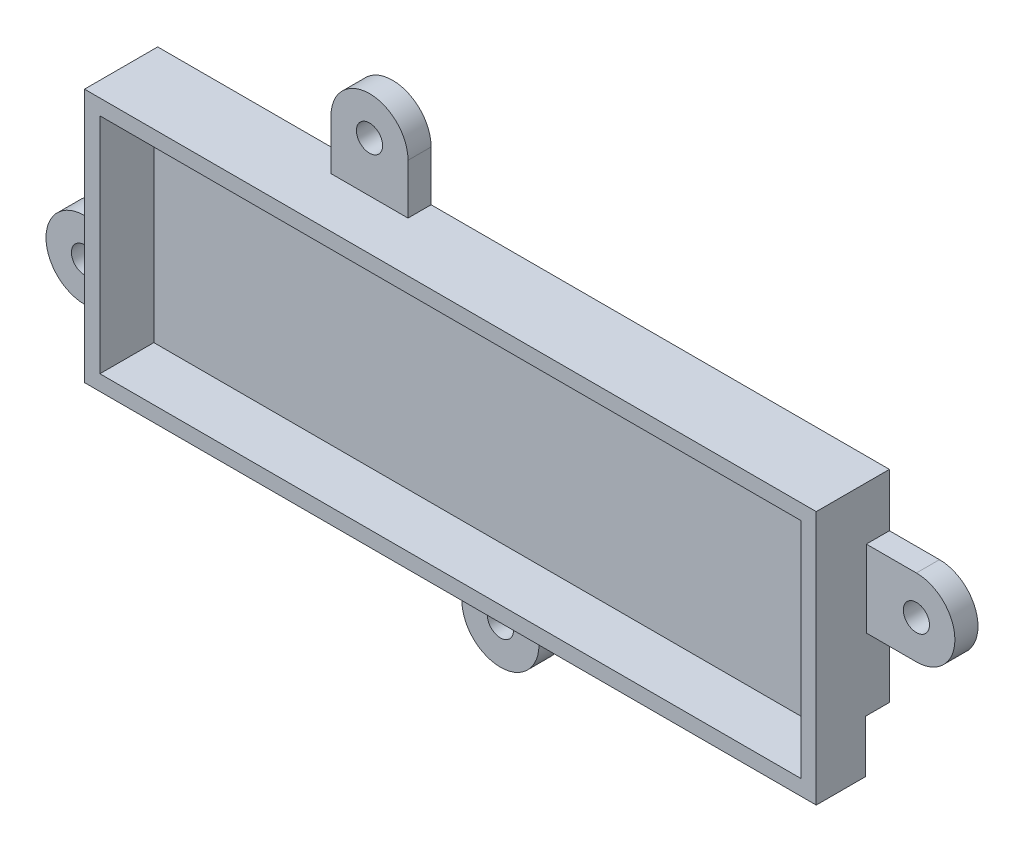
ISO-10303-21;
HEADER;
FILE_DESCRIPTION(('STEP AP214'),'2;1');
FILE_NAME('part.step','',(''),(''),'','','');
FILE_SCHEMA(('AUTOMOTIVE_DESIGN { 1 0 10303 214 1 1 1 1 }'));
ENDSEC;
DATA;
#1=APPLICATION_CONTEXT('core data for automotive mechanical design processes');
#2=APPLICATION_PROTOCOL_DEFINITION('international standard','automotive_design',2000,#1);
#3=PRODUCT_CONTEXT('',#1,'mechanical');
#4=PRODUCT('Part','Part','',(#3));
#5=PRODUCT_RELATED_PRODUCT_CATEGORY('part','',(#4));
#6=PRODUCT_DEFINITION_FORMATION('','',#4);
#7=PRODUCT_DEFINITION_CONTEXT('part definition',#1,'design');
#8=PRODUCT_DEFINITION('design','',#6,#7);
#9=PRODUCT_DEFINITION_SHAPE('','',#8);
#10=(LENGTH_UNIT() NAMED_UNIT(*) SI_UNIT(.MILLI.,.METRE.));
#11=(NAMED_UNIT(*) PLANE_ANGLE_UNIT() SI_UNIT($,.RADIAN.));
#12=(NAMED_UNIT(*) SI_UNIT($,.STERADIAN.) SOLID_ANGLE_UNIT());
#13=UNCERTAINTY_MEASURE_WITH_UNIT(LENGTH_MEASURE(1.E-05),#10,'distance_accuracy_value','');
#14=(GEOMETRIC_REPRESENTATION_CONTEXT(3) GLOBAL_UNCERTAINTY_ASSIGNED_CONTEXT((#13)) GLOBAL_UNIT_ASSIGNED_CONTEXT((#10,
#11,#12)) REPRESENTATION_CONTEXT('',''));
#15=CARTESIAN_POINT('',(0.,0.,0.));
#16=DIRECTION('',(0.,0.,1.));
#17=DIRECTION('',(1.,0.,0.));
#18=AXIS2_PLACEMENT_3D('',#15,#16,#17);
#19=CARTESIAN_POINT('',(6.5,119.6,184.5));
#20=DIRECTION('',(0.,0.,1.));
#21=DIRECTION('',(1.,0.,0.));
#22=AXIS2_PLACEMENT_3D('',#19,#20,#21);
#23=PLANE('',#22);
#24=CARTESIAN_POINT('',(14.,124.6,184.5));
#25=DIRECTION('',(0.,0.,1.));
#26=DIRECTION('',(1.,0.,0.));
#27=AXIS2_PLACEMENT_3D('',#24,#25,#26);
#28=CIRCLE('',#27,1.7);
#29=CARTESIAN_POINT('',(15.7,124.6,184.5));
#30=VERTEX_POINT('',#29);
#31=EDGE_CURVE('E10',#30,#30,#28,.T.);
#32=ORIENTED_EDGE('',*,*,#31,.F.);
#33=EDGE_LOOP('',(#32));
#34=FACE_BOUND('',#33,.T.);
#35=DIRECTION('',(1.,0.,0.));
#36=VECTOR('',#35,1.);
#37=CARTESIAN_POINT('',(6.5,129.6,184.5));
#38=LINE('',#37,#36);
#39=CARTESIAN_POINT('',(7.5,129.6,184.5));
#40=VERTEX_POINT('',#39);
#41=CARTESIAN_POINT('',(14.,129.6,184.5));
#42=VERTEX_POINT('',#41);
#43=EDGE_CURVE('E343',#40,#42,#38,.T.);
#44=ORIENTED_EDGE('',*,*,#43,.F.);
#45=DIRECTION('',(0.,-1.,0.));
#46=VECTOR('',#45,1.);
#47=CARTESIAN_POINT('',(7.5,111.55,184.5));
#48=LINE('',#47,#46);
#49=CARTESIAN_POINT('',(7.5,119.6,184.5));
#50=VERTEX_POINT('',#49);
#51=EDGE_CURVE('E304',#40,#50,#48,.T.);
#52=ORIENTED_EDGE('',*,*,#51,.T.);
#53=DIRECTION('',(1.,0.,0.));
#54=VECTOR('',#53,1.);
#55=CARTESIAN_POINT('',(6.5,119.6,184.5));
#56=LINE('',#55,#54);
#57=CARTESIAN_POINT('',(14.,119.6,184.5));
#58=VERTEX_POINT('',#57);
#59=EDGE_CURVE('E238',#50,#58,#56,.T.);
#60=ORIENTED_EDGE('',*,*,#59,.T.);
#61=CARTESIAN_POINT('',(14.,124.6,184.5));
#62=DIRECTION('',(0.,0.,1.));
#63=DIRECTION('',(0.,-1.,0.));
#64=AXIS2_PLACEMENT_3D('',#61,#62,#63);
#65=CIRCLE('',#64,5.);
#66=EDGE_CURVE('E59',#58,#42,#65,.T.);
#67=ORIENTED_EDGE('',*,*,#66,.T.);
#68=EDGE_LOOP('',(#44,#52,#60,#67));
#69=FACE_BOUND('',#68,.T.);
#70=ADVANCED_FACE('F15',(#34,#69),#23,.T.);
#71=CARTESIAN_POINT('',(-87.5,103.5,184.));
#72=DIRECTION('',(0.,0.,1.));
#73=DIRECTION('',(1.,0.,0.));
#74=AXIS2_PLACEMENT_3D('',#71,#72,#73);
#75=PLANE('',#74);
#76=DIRECTION('',(-1.,0.,0.));
#77=VECTOR('',#76,1.);
#78=CARTESIAN_POINT('',(-86.5,105.5,184.));
#79=LINE('',#78,#77);
#80=CARTESIAN_POINT('',(3.276415975525,105.5,184.));
#81=VERTEX_POINT('',#80);
#82=CARTESIAN_POINT('',(-85.5,105.5,184.));
#83=VERTEX_POINT('',#82);
#84=EDGE_CURVE('E246',#81,#83,#79,.T.);
#85=ORIENTED_EDGE('',*,*,#84,.F.);
#86=CARTESIAN_POINT('',(7.195222563132,106.30184470374,184.));
#87=DIRECTION('',(0.,0.,1.));
#88=DIRECTION('',(1.,0.,0.));
#89=AXIS2_PLACEMENT_3D('',#86,#87,#88);
#90=CIRCLE('',#89,4.);
#91=CARTESIAN_POINT('',(5.5,109.92485732605,184.));
#92=VERTEX_POINT('',#91);
#93=EDGE_CURVE('E311',#92,#81,#90,.T.);
#94=ORIENTED_EDGE('',*,*,#93,.F.);
#95=DIRECTION('',(0.,1.,0.));
#96=VECTOR('',#95,1.);
#97=CARTESIAN_POINT('',(5.5,104.5,184.));
#98=LINE('',#97,#96);
#99=CARTESIAN_POINT('',(5.5,134.5,184.));
#100=VERTEX_POINT('',#99);
#101=EDGE_CURVE('E443',#92,#100,#98,.T.);
#102=ORIENTED_EDGE('',*,*,#101,.T.);
#103=DIRECTION('',(-1.,0.,0.));
#104=VECTOR('',#103,1.);
#105=CARTESIAN_POINT('',(-86.5,134.5,184.));
#106=LINE('',#105,#104);
#107=CARTESIAN_POINT('',(-85.5,134.5,184.));
#108=VERTEX_POINT('',#107);
#109=EDGE_CURVE('E450',#100,#108,#106,.T.);
#110=ORIENTED_EDGE('',*,*,#109,.T.);
#111=DIRECTION('',(0.,1.,0.));
#112=VECTOR('',#111,1.);
#113=CARTESIAN_POINT('',(-85.5,104.5,184.));
#114=LINE('',#113,#112);
#115=EDGE_CURVE('E459',#83,#108,#114,.T.);
#116=ORIENTED_EDGE('',*,*,#115,.F.);
#117=EDGE_LOOP('',(#85,#94,#102,#110,#116));
#118=FACE_BOUND('',#117,.T.);
#119=ADVANCED_FACE('F747',(#118),#75,.T.);
#120=CARTESIAN_POINT('',(14.,124.6,181.4));
#121=DIRECTION('',(0.,0.,1.));
#122=DIRECTION('',(1.,0.,0.));
#123=AXIS2_PLACEMENT_3D('',#120,#121,#122);
#124=CYLINDRICAL_SURFACE('',#123,1.7);
#125=DIRECTION('',(0.,0.,1.));
#126=VECTOR('',#125,1.);
#127=CARTESIAN_POINT('',(15.7,124.6,181.4));
#128=LINE('',#127,#126);
#129=CARTESIAN_POINT('',(15.7,124.6,181.5));
#130=VERTEX_POINT('',#129);
#131=EDGE_CURVE('E26',#130,#30,#128,.T.);
#132=ORIENTED_EDGE('',*,*,#131,.F.);
#133=CARTESIAN_POINT('',(14.,124.6,181.5));
#134=DIRECTION('',(0.,0.,1.));
#135=DIRECTION('',(1.,0.,0.));
#136=AXIS2_PLACEMENT_3D('',#133,#134,#135);
#137=CIRCLE('',#136,1.7);
#138=EDGE_CURVE('E437',#130,#130,#137,.T.);
#139=ORIENTED_EDGE('',*,*,#138,.F.);
#140=ORIENTED_EDGE('',*,*,#131,.T.);
#141=ORIENTED_EDGE('',*,*,#31,.T.);
#142=EDGE_LOOP('',(#132,#139,#140,#141));
#143=FACE_BOUND('',#142,.T.);
#144=ADVANCED_FACE('F753',(#143),#124,.F.);
#145=CARTESIAN_POINT('',(-57.,143.,181.4));
#146=DIRECTION('',(0.,0.,1.));
#147=DIRECTION('',(1.,0.,0.));
#148=AXIS2_PLACEMENT_3D('',#145,#146,#147);
#149=CYLINDRICAL_SURFACE('',#148,1.7);
#150=DIRECTION('',(0.,0.,1.));
#151=VECTOR('',#150,1.);
#152=CARTESIAN_POINT('',(-55.3,143.,181.4));
#153=LINE('',#152,#151);
#154=CARTESIAN_POINT('',(-55.3,143.,181.5));
#155=VERTEX_POINT('',#154);
#156=CARTESIAN_POINT('',(-55.3,143.,184.5));
#157=VERTEX_POINT('',#156);
#158=EDGE_CURVE('E72',#155,#157,#153,.T.);
#159=ORIENTED_EDGE('',*,*,#158,.F.);
#160=CARTESIAN_POINT('',(-57.,143.,181.5));
#161=DIRECTION('',(0.,0.,1.));
#162=DIRECTION('',(1.,0.,0.));
#163=AXIS2_PLACEMENT_3D('',#160,#161,#162);
#164=CIRCLE('',#163,1.7);
#165=EDGE_CURVE('E385',#155,#155,#164,.T.);
#166=ORIENTED_EDGE('',*,*,#165,.F.);
#167=ORIENTED_EDGE('',*,*,#158,.T.);
#168=CARTESIAN_POINT('',(-57.,143.,184.5));
#169=DIRECTION('',(0.,0.,1.));
#170=DIRECTION('',(1.,0.,0.));
#171=AXIS2_PLACEMENT_3D('',#168,#169,#170);
#172=CIRCLE('',#171,1.7);
#173=EDGE_CURVE('E237',#157,#157,#172,.T.);
#174=ORIENTED_EDGE('',*,*,#173,.T.);
#175=EDGE_LOOP('',(#159,#166,#167,#174));
#176=FACE_BOUND('',#175,.T.);
#177=ADVANCED_FACE('F898',(#176),#149,.F.);
#178=CARTESIAN_POINT('',(-40.,97.,181.4));
#179=DIRECTION('',(0.,0.,1.));
#180=DIRECTION('',(1.,0.,0.));
#181=AXIS2_PLACEMENT_3D('',#178,#179,#180);
#182=CYLINDRICAL_SURFACE('',#181,1.7);
#183=DIRECTION('',(0.,0.,1.));
#184=VECTOR('',#183,1.);
#185=CARTESIAN_POINT('',(-38.3,97.,181.4));
#186=LINE('',#185,#184);
#187=CARTESIAN_POINT('',(-38.3,97.,181.5));
#188=VERTEX_POINT('',#187);
#189=CARTESIAN_POINT('',(-38.3,97.,184.5));
#190=VERTEX_POINT('',#189);
#191=EDGE_CURVE('E341',#188,#190,#186,.T.);
#192=ORIENTED_EDGE('',*,*,#191,.F.);
#193=CARTESIAN_POINT('',(-40.,97.,181.5));
#194=DIRECTION('',(0.,0.,1.));
#195=DIRECTION('',(1.,0.,0.));
#196=AXIS2_PLACEMENT_3D('',#193,#194,#195);
#197=CIRCLE('',#196,1.7);
#198=EDGE_CURVE('E381',#188,#188,#197,.T.);
#199=ORIENTED_EDGE('',*,*,#198,.F.);
#200=ORIENTED_EDGE('',*,*,#191,.T.);
#201=CARTESIAN_POINT('',(-40.,97.,184.5));
#202=DIRECTION('',(0.,0.,1.));
#203=DIRECTION('',(1.,0.,0.));
#204=AXIS2_PLACEMENT_3D('',#201,#202,#203);
#205=CIRCLE('',#204,1.7);
#206=EDGE_CURVE('E229',#190,#190,#205,.T.);
#207=ORIENTED_EDGE('',*,*,#206,.T.);
#208=EDGE_LOOP('',(#192,#199,#200,#207));
#209=FACE_BOUND('',#208,.T.);
#210=ADVANCED_FACE('F554',(#209),#182,.F.);
#211=CARTESIAN_POINT('',(-94.,110.8,181.4));
#212=DIRECTION('',(0.,0.,1.));
#213=DIRECTION('',(1.,0.,0.));
#214=AXIS2_PLACEMENT_3D('',#211,#212,#213);
#215=CYLINDRICAL_SURFACE('',#214,1.7);
#216=DIRECTION('',(0.,0.,1.));
#217=VECTOR('',#216,1.);
#218=CARTESIAN_POINT('',(-92.3,110.8,181.4));
#219=LINE('',#218,#217);
#220=CARTESIAN_POINT('',(-92.3,110.8,181.5));
#221=VERTEX_POINT('',#220);
#222=CARTESIAN_POINT('',(-92.3,110.8,184.5));
#223=VERTEX_POINT('',#222);
#224=EDGE_CURVE('E241',#221,#223,#219,.T.);
#225=ORIENTED_EDGE('',*,*,#224,.F.);
#226=CARTESIAN_POINT('',(-94.,110.8,181.5));
#227=DIRECTION('',(0.,0.,1.));
#228=DIRECTION('',(1.,0.,0.));
#229=AXIS2_PLACEMENT_3D('',#226,#227,#228);
#230=CIRCLE('',#229,1.7);
#231=EDGE_CURVE('E217',#221,#221,#230,.T.);
#232=ORIENTED_EDGE('',*,*,#231,.F.);
#233=ORIENTED_EDGE('',*,*,#224,.T.);
#234=CARTESIAN_POINT('',(-94.,110.8,184.5));
#235=DIRECTION('',(0.,0.,1.));
#236=DIRECTION('',(1.,0.,0.));
#237=AXIS2_PLACEMENT_3D('',#234,#235,#236);
#238=CIRCLE('',#237,1.7);
#239=EDGE_CURVE('E228',#223,#223,#238,.T.);
#240=ORIENTED_EDGE('',*,*,#239,.T.);
#241=EDGE_LOOP('',(#225,#232,#233,#240));
#242=FACE_BOUND('',#241,.T.);
#243=ADVANCED_FACE('F769',(#242),#215,.F.);
#244=CARTESIAN_POINT('',(-40.,97.,181.5));
#245=DIRECTION('',(0.,0.,1.));
#246=DIRECTION('',(1.,0.,0.));
#247=AXIS2_PLACEMENT_3D('',#244,#245,#246);
#248=CYLINDRICAL_SURFACE('',#247,5.);
#249=DIRECTION('',(0.,0.,1.));
#250=VECTOR('',#249,1.);
#251=CARTESIAN_POINT('',(-35.,97.,181.5));
#252=LINE('',#251,#250);
#253=CARTESIAN_POINT('',(-35.,97.,181.5));
#254=VERTEX_POINT('',#253);
#255=CARTESIAN_POINT('',(-35.,97.,184.5));
#256=VERTEX_POINT('',#255);
#257=EDGE_CURVE('E233',#254,#256,#252,.T.);
#258=ORIENTED_EDGE('',*,*,#257,.T.);
#259=CARTESIAN_POINT('',(-40.,97.,184.5));
#260=DIRECTION('',(0.,0.,1.));
#261=DIRECTION('',(1.,0.,0.));
#262=AXIS2_PLACEMENT_3D('',#259,#260,#261);
#263=CIRCLE('',#262,5.);
#264=CARTESIAN_POINT('',(-45.,97.,184.5));
#265=VERTEX_POINT('',#264);
#266=EDGE_CURVE('E234',#265,#256,#263,.T.);
#267=ORIENTED_EDGE('',*,*,#266,.F.);
#268=DIRECTION('',(0.,0.,1.));
#269=VECTOR('',#268,1.);
#270=CARTESIAN_POINT('',(-45.,97.,181.5));
#271=LINE('',#270,#269);
#272=CARTESIAN_POINT('',(-45.,97.,181.5));
#273=VERTEX_POINT('',#272);
#274=EDGE_CURVE('E227',#273,#265,#271,.T.);
#275=ORIENTED_EDGE('',*,*,#274,.F.);
#276=CARTESIAN_POINT('',(-40.,97.,181.5));
#277=DIRECTION('',(0.,0.,1.));
#278=DIRECTION('',(1.,0.,0.));
#279=AXIS2_PLACEMENT_3D('',#276,#277,#278);
#280=CIRCLE('',#279,5.);
#281=EDGE_CURVE('E390',#273,#254,#280,.T.);
#282=ORIENTED_EDGE('',*,*,#281,.T.);
#283=EDGE_LOOP('',(#258,#267,#275,#282));
#284=FACE_BOUND('',#283,.T.);
#285=ADVANCED_FACE('F761',(#284),#248,.T.);
#286=CARTESIAN_POINT('',(6.5,119.6,181.5));
#287=DIRECTION('',(0.,1.,0.));
#288=DIRECTION('',(1.,0.,0.));
#289=AXIS2_PLACEMENT_3D('',#286,#287,#288);
#290=PLANE('',#289);
#291=DIRECTION('',(0.,0.,1.));
#292=VECTOR('',#291,1.);
#293=CARTESIAN_POINT('',(14.,119.6,181.5));
#294=LINE('',#293,#292);
#295=CARTESIAN_POINT('',(14.,119.6,181.5));
#296=VERTEX_POINT('',#295);
#297=EDGE_CURVE('E242',#296,#58,#294,.T.);
#298=ORIENTED_EDGE('',*,*,#297,.T.);
#299=ORIENTED_EDGE('',*,*,#59,.F.);
#300=DIRECTION('',(0.,0.,1.));
#301=VECTOR('',#300,1.);
#302=CARTESIAN_POINT('',(7.5,119.6,181.5));
#303=LINE('',#302,#301);
#304=CARTESIAN_POINT('',(7.5,119.6,181.5));
#305=VERTEX_POINT('',#304);
#306=EDGE_CURVE('E300',#305,#50,#303,.T.);
#307=ORIENTED_EDGE('',*,*,#306,.F.);
#308=DIRECTION('',(1.,0.,0.));
#309=VECTOR('',#308,1.);
#310=CARTESIAN_POINT('',(6.5,119.6,181.5));
#311=LINE('',#310,#309);
#312=EDGE_CURVE('E223',#305,#296,#311,.T.);
#313=ORIENTED_EDGE('',*,*,#312,.T.);
#314=EDGE_LOOP('',(#298,#299,#307,#313));
#315=FACE_BOUND('',#314,.T.);
#316=ADVANCED_FACE('F758',(#315),#290,.F.);
#317=CARTESIAN_POINT('',(14.,124.6,181.5));
#318=DIRECTION('',(0.,0.,1.));
#319=DIRECTION('',(1.,0.,0.));
#320=AXIS2_PLACEMENT_3D('',#317,#318,#319);
#321=CYLINDRICAL_SURFACE('',#320,5.);
#322=CARTESIAN_POINT('',(14.,124.6,181.5));
#323=DIRECTION('',(0.,0.,-1.));
#324=DIRECTION('',(0.,1.,0.));
#325=AXIS2_PLACEMENT_3D('',#322,#323,#324);
#326=CIRCLE('',#325,5.);
#327=CARTESIAN_POINT('',(14.,129.6,181.5));
#328=VERTEX_POINT('',#327);
#329=EDGE_CURVE('E251',#328,#296,#326,.T.);
#330=ORIENTED_EDGE('',*,*,#329,.F.);
#331=DIRECTION('',(0.,0.,1.));
#332=VECTOR('',#331,1.);
#333=CARTESIAN_POINT('',(14.,129.6,181.5));
#334=LINE('',#333,#332);
#335=EDGE_CURVE('E320',#328,#42,#334,.T.);
#336=ORIENTED_EDGE('',*,*,#335,.T.);
#337=ORIENTED_EDGE('',*,*,#66,.F.);
#338=ORIENTED_EDGE('',*,*,#297,.F.);
#339=EDGE_LOOP('',(#330,#336,#337,#338));
#340=FACE_BOUND('',#339,.T.);
#341=ADVANCED_FACE('F760',(#340),#321,.T.);
#342=CARTESIAN_POINT('',(6.5,129.6,181.5));
#343=DIRECTION('',(0.,1.,0.));
#344=DIRECTION('',(1.,0.,0.));
#345=AXIS2_PLACEMENT_3D('',#342,#343,#344);
#346=PLANE('',#345);
#347=DIRECTION('',(1.,0.,0.));
#348=VECTOR('',#347,1.);
#349=CARTESIAN_POINT('',(6.5,129.6,181.5));
#350=LINE('',#349,#348);
#351=CARTESIAN_POINT('',(7.5,129.6,181.5));
#352=VERTEX_POINT('',#351);
#353=EDGE_CURVE('E278',#352,#328,#350,.T.);
#354=ORIENTED_EDGE('',*,*,#353,.F.);
#355=DIRECTION('',(0.,0.,1.));
#356=VECTOR('',#355,1.);
#357=CARTESIAN_POINT('',(7.5,129.6,181.5));
#358=LINE('',#357,#356);
#359=EDGE_CURVE('E247',#352,#40,#358,.T.);
#360=ORIENTED_EDGE('',*,*,#359,.T.);
#361=ORIENTED_EDGE('',*,*,#43,.T.);
#362=ORIENTED_EDGE('',*,*,#335,.F.);
#363=EDGE_LOOP('',(#354,#360,#361,#362));
#364=FACE_BOUND('',#363,.T.);
#365=ADVANCED_FACE('F672',(#364),#346,.T.);
#366=CARTESIAN_POINT('',(-57.,143.,181.5));
#367=DIRECTION('',(0.,0.,1.));
#368=DIRECTION('',(1.,0.,0.));
#369=AXIS2_PLACEMENT_3D('',#366,#367,#368);
#370=CYLINDRICAL_SURFACE('',#369,5.);
#371=CARTESIAN_POINT('',(-57.,143.,184.5));
#372=DIRECTION('',(0.,0.,1.));
#373=DIRECTION('',(1.,0.,0.));
#374=AXIS2_PLACEMENT_3D('',#371,#372,#373);
#375=CIRCLE('',#374,5.);
#376=CARTESIAN_POINT('',(-52.,143.,184.5));
#377=VERTEX_POINT('',#376);
#378=CARTESIAN_POINT('',(-62.,143.,184.5));
#379=VERTEX_POINT('',#378);
#380=EDGE_CURVE('E189',#377,#379,#375,.T.);
#381=ORIENTED_EDGE('',*,*,#380,.F.);
#382=DIRECTION('',(0.,0.,1.));
#383=VECTOR('',#382,1.);
#384=CARTESIAN_POINT('',(-52.,143.,181.5));
#385=LINE('',#384,#383);
#386=CARTESIAN_POINT('',(-52.,143.,181.5));
#387=VERTEX_POINT('',#386);
#388=EDGE_CURVE('E184',#387,#377,#385,.T.);
#389=ORIENTED_EDGE('',*,*,#388,.F.);
#390=CARTESIAN_POINT('',(-57.,143.,181.5));
#391=DIRECTION('',(0.,0.,1.));
#392=DIRECTION('',(1.,0.,0.));
#393=AXIS2_PLACEMENT_3D('',#390,#391,#392);
#394=CIRCLE('',#393,5.);
#395=CARTESIAN_POINT('',(-62.,143.,181.5));
#396=VERTEX_POINT('',#395);
#397=EDGE_CURVE('E321',#387,#396,#394,.T.);
#398=ORIENTED_EDGE('',*,*,#397,.T.);
#399=DIRECTION('',(0.,0.,1.));
#400=VECTOR('',#399,1.);
#401=CARTESIAN_POINT('',(-62.,143.,181.5));
#402=LINE('',#401,#400);
#403=EDGE_CURVE('E467',#396,#379,#402,.T.);
#404=ORIENTED_EDGE('',*,*,#403,.T.);
#405=EDGE_LOOP('',(#381,#389,#398,#404));
#406=FACE_BOUND('',#405,.T.);
#407=ADVANCED_FACE('F17',(#406),#370,.T.);
#408=CARTESIAN_POINT('',(-94.,110.8,181.5));
#409=DIRECTION('',(0.,0.,1.));
#410=DIRECTION('',(1.,0.,0.));
#411=AXIS2_PLACEMENT_3D('',#408,#409,#410);
#412=CYLINDRICAL_SURFACE('',#411,5.);
#413=CARTESIAN_POINT('',(-94.,110.8,184.5));
#414=DIRECTION('',(0.,0.,1.));
#415=DIRECTION('',(1.,0.,0.));
#416=AXIS2_PLACEMENT_3D('',#413,#414,#415);
#417=CIRCLE('',#416,5.);
#418=CARTESIAN_POINT('',(-94.,115.8,184.5));
#419=VERTEX_POINT('',#418);
#420=CARTESIAN_POINT('',(-94.,105.8,184.5));
#421=VERTEX_POINT('',#420);
#422=EDGE_CURVE('E117',#419,#421,#417,.T.);
#423=ORIENTED_EDGE('',*,*,#422,.F.);
#424=DIRECTION('',(0.,0.,1.));
#425=VECTOR('',#424,1.);
#426=CARTESIAN_POINT('',(-94.,115.8,181.5));
#427=LINE('',#426,#425);
#428=CARTESIAN_POINT('',(-94.,115.8,181.5));
#429=VERTEX_POINT('',#428);
#430=EDGE_CURVE('E294',#429,#419,#427,.T.);
#431=ORIENTED_EDGE('',*,*,#430,.F.);
#432=CARTESIAN_POINT('',(-94.,110.8,181.5));
#433=DIRECTION('',(0.,0.,1.));
#434=DIRECTION('',(1.,0.,0.));
#435=AXIS2_PLACEMENT_3D('',#432,#433,#434);
#436=CIRCLE('',#435,5.);
#437=CARTESIAN_POINT('',(-94.,105.8,181.5));
#438=VERTEX_POINT('',#437);
#439=EDGE_CURVE('E483',#429,#438,#436,.T.);
#440=ORIENTED_EDGE('',*,*,#439,.T.);
#441=DIRECTION('',(0.,0.,1.));
#442=VECTOR('',#441,1.);
#443=CARTESIAN_POINT('',(-94.,105.8,181.5));
#444=LINE('',#443,#442);
#445=EDGE_CURVE('E224',#438,#421,#444,.T.);
#446=ORIENTED_EDGE('',*,*,#445,.T.);
#447=EDGE_LOOP('',(#423,#431,#440,#446));
#448=FACE_BOUND('',#447,.T.);
#449=ADVANCED_FACE('F580',(#448),#412,.T.);
#450=CARTESIAN_POINT('',(-52.,135.5,181.5));
#451=DIRECTION('',(1.,0.,0.));
#452=DIRECTION('',(0.,1.,0.));
#453=AXIS2_PLACEMENT_3D('',#450,#451,#452);
#454=PLANE('',#453);
#455=DIRECTION('',(0.,1.,0.));
#456=VECTOR('',#455,1.);
#457=CARTESIAN_POINT('',(-52.,135.5,184.5));
#458=LINE('',#457,#456);
#459=CARTESIAN_POINT('',(-52.,136.5,184.5));
#460=VERTEX_POINT('',#459);
#461=EDGE_CURVE('E176',#460,#377,#458,.T.);
#462=ORIENTED_EDGE('',*,*,#461,.F.);
#463=DIRECTION('',(0.,0.,-1.));
#464=VECTOR('',#463,1.);
#465=CARTESIAN_POINT('',(-52.,136.5,181.5));
#466=LINE('',#465,#464);
#467=CARTESIAN_POINT('',(-52.,136.5,181.5));
#468=VERTEX_POINT('',#467);
#469=EDGE_CURVE('E181',#460,#468,#466,.T.);
#470=ORIENTED_EDGE('',*,*,#469,.T.);
#471=DIRECTION('',(0.,1.,0.));
#472=VECTOR('',#471,1.);
#473=CARTESIAN_POINT('',(-52.,135.5,181.5));
#474=LINE('',#473,#472);
#475=EDGE_CURVE('E325',#468,#387,#474,.T.);
#476=ORIENTED_EDGE('',*,*,#475,.T.);
#477=ORIENTED_EDGE('',*,*,#388,.T.);
#478=EDGE_LOOP('',(#462,#470,#476,#477));
#479=FACE_BOUND('',#478,.T.);
#480=ADVANCED_FACE('F178',(#479),#454,.T.);
#481=CARTESIAN_POINT('',(-62.,135.5,184.5));
#482=DIRECTION('',(0.,0.,1.));
#483=DIRECTION('',(1.,0.,0.));
#484=AXIS2_PLACEMENT_3D('',#481,#482,#483);
#485=PLANE('',#484);
#486=ORIENTED_EDGE('',*,*,#173,.F.);
#487=EDGE_LOOP('',(#486));
#488=FACE_BOUND('',#487,.T.);
#489=DIRECTION('',(1.,0.,0.));
#490=VECTOR('',#489,1.);
#491=CARTESIAN_POINT('',(-74.75,136.5,184.5));
#492=LINE('',#491,#490);
#493=CARTESIAN_POINT('',(-62.,136.5,184.5));
#494=VERTEX_POINT('',#493);
#495=EDGE_CURVE('E193',#494,#460,#492,.T.);
#496=ORIENTED_EDGE('',*,*,#495,.T.);
#497=ORIENTED_EDGE('',*,*,#461,.T.);
#498=ORIENTED_EDGE('',*,*,#380,.T.);
#499=DIRECTION('',(0.,1.,0.));
#500=VECTOR('',#499,1.);
#501=CARTESIAN_POINT('',(-62.,135.5,184.5));
#502=LINE('',#501,#500);
#503=EDGE_CURVE('E190',#494,#379,#502,.T.);
#504=ORIENTED_EDGE('',*,*,#503,.F.);
#505=EDGE_LOOP('',(#496,#497,#498,#504));
#506=FACE_BOUND('',#505,.T.);
#507=ADVANCED_FACE('F194',(#488,#506),#485,.T.);
#508=CARTESIAN_POINT('',(-62.,135.5,181.5));
#509=DIRECTION('',(1.,0.,0.));
#510=DIRECTION('',(0.,1.,0.));
#511=AXIS2_PLACEMENT_3D('',#508,#509,#510);
#512=PLANE('',#511);
#513=ORIENTED_EDGE('',*,*,#403,.F.);
#514=DIRECTION('',(0.,1.,0.));
#515=VECTOR('',#514,1.);
#516=CARTESIAN_POINT('',(-62.,135.5,181.5));
#517=LINE('',#516,#515);
#518=CARTESIAN_POINT('',(-62.,136.5,181.5));
#519=VERTEX_POINT('',#518);
#520=EDGE_CURVE('E326',#519,#396,#517,.T.);
#521=ORIENTED_EDGE('',*,*,#520,.F.);
#522=DIRECTION('',(0.,0.,-1.));
#523=VECTOR('',#522,1.);
#524=CARTESIAN_POINT('',(-62.,136.5,181.5));
#525=LINE('',#524,#523);
#526=EDGE_CURVE('E200',#494,#519,#525,.T.);
#527=ORIENTED_EDGE('',*,*,#526,.F.);
#528=ORIENTED_EDGE('',*,*,#503,.T.);
#529=EDGE_LOOP('',(#513,#521,#527,#528));
#530=FACE_BOUND('',#529,.T.);
#531=ADVANCED_FACE('F702',(#530),#512,.F.);
#532=CARTESIAN_POINT('',(-85.5,105.5,183.9));
#533=DIRECTION('',(1.,0.,0.));
#534=DIRECTION('',(0.,1.,0.));
#535=AXIS2_PLACEMENT_3D('',#532,#533,#534);
#536=PLANE('',#535);
#537=DIRECTION('',(0.,0.,1.));
#538=VECTOR('',#537,1.);
#539=CARTESIAN_POINT('',(-85.5,105.5,183.9));
#540=LINE('',#539,#538);
#541=CARTESIAN_POINT('',(-85.5,105.5,191.));
#542=VERTEX_POINT('',#541);
#543=EDGE_CURVE('E475',#83,#542,#540,.T.);
#544=ORIENTED_EDGE('',*,*,#543,.F.);
#545=ORIENTED_EDGE('',*,*,#115,.T.);
#546=DIRECTION('',(0.,0.,1.));
#547=VECTOR('',#546,1.);
#548=CARTESIAN_POINT('',(-85.5,134.5,183.9));
#549=LINE('',#548,#547);
#550=CARTESIAN_POINT('',(-85.5,134.5,191.));
#551=VERTEX_POINT('',#550);
#552=EDGE_CURVE('E446',#108,#551,#549,.T.);
#553=ORIENTED_EDGE('',*,*,#552,.T.);
#554=DIRECTION('',(0.,1.,0.));
#555=VECTOR('',#554,1.);
#556=CARTESIAN_POINT('',(-85.5,104.5,191.));
#557=LINE('',#556,#555);
#558=EDGE_CURVE('E397',#542,#551,#557,.T.);
#559=ORIENTED_EDGE('',*,*,#558,.F.);
#560=EDGE_LOOP('',(#544,#545,#553,#559));
#561=FACE_BOUND('',#560,.T.);
#562=ADVANCED_FACE('F756',(#561),#536,.T.);
#563=CARTESIAN_POINT('',(-85.5,134.5,183.9));
#564=DIRECTION('',(0.,1.,0.));
#565=DIRECTION('',(1.,0.,0.));
#566=AXIS2_PLACEMENT_3D('',#563,#564,#565);
#567=PLANE('',#566);
#568=DIRECTION('',(-1.,0.,0.));
#569=VECTOR('',#568,1.);
#570=CARTESIAN_POINT('',(-86.5,134.5,191.));
#571=LINE('',#570,#569);
#572=CARTESIAN_POINT('',(5.5,134.5,191.));
#573=VERTEX_POINT('',#572);
#574=EDGE_CURVE('E299',#573,#551,#571,.T.);
#575=ORIENTED_EDGE('',*,*,#574,.T.);
#576=ORIENTED_EDGE('',*,*,#552,.F.);
#577=ORIENTED_EDGE('',*,*,#109,.F.);
#578=DIRECTION('',(0.,0.,1.));
#579=VECTOR('',#578,1.);
#580=CARTESIAN_POINT('',(5.5,134.5,183.9));
#581=LINE('',#580,#579);
#582=EDGE_CURVE('E447',#100,#573,#581,.T.);
#583=ORIENTED_EDGE('',*,*,#582,.T.);
#584=EDGE_LOOP('',(#575,#576,#577,#583));
#585=FACE_BOUND('',#584,.T.);
#586=ADVANCED_FACE('F837',(#585),#567,.F.);
#587=CARTESIAN_POINT('',(5.5,105.5,183.9));
#588=DIRECTION('',(1.,0.,0.));
#589=DIRECTION('',(0.,1.,0.));
#590=AXIS2_PLACEMENT_3D('',#587,#588,#589);
#591=PLANE('',#590);
#592=DIRECTION('',(0.,1.,0.));
#593=VECTOR('',#592,1.);
#594=CARTESIAN_POINT('',(5.5,104.5,191.));
#595=LINE('',#594,#593);
#596=CARTESIAN_POINT('',(5.5,105.5,191.));
#597=VERTEX_POINT('',#596);
#598=EDGE_CURVE('E295',#597,#573,#595,.T.);
#599=ORIENTED_EDGE('',*,*,#598,.T.);
#600=ORIENTED_EDGE('',*,*,#582,.F.);
#601=ORIENTED_EDGE('',*,*,#101,.F.);
#602=DIRECTION('',(0.,0.,1.));
#603=VECTOR('',#602,1.);
#604=CARTESIAN_POINT('',(5.5,109.92485732605,181.4));
#605=LINE('',#604,#603);
#606=CARTESIAN_POINT('',(5.5,109.92485732605,184.6));
#607=VERTEX_POINT('',#606);
#608=EDGE_CURVE('E258',#92,#607,#605,.T.);
#609=ORIENTED_EDGE('',*,*,#608,.T.);
#610=DIRECTION('',(0.,-1.,0.));
#611=VECTOR('',#610,1.);
#612=CARTESIAN_POINT('',(5.5,105.90092235187,184.6));
#613=LINE('',#612,#611);
#614=CARTESIAN_POINT('',(5.5,105.5,184.6));
#615=VERTEX_POINT('',#614);
#616=EDGE_CURVE('E306',#607,#615,#613,.T.);
#617=ORIENTED_EDGE('',*,*,#616,.T.);
#618=DIRECTION('',(0.,0.,1.));
#619=VECTOR('',#618,1.);
#620=CARTESIAN_POINT('',(5.5,105.5,183.9));
#621=LINE('',#620,#619);
#622=EDGE_CURVE('E243',#615,#597,#621,.T.);
#623=ORIENTED_EDGE('',*,*,#622,.T.);
#624=EDGE_LOOP('',(#599,#600,#601,#609,#617,#623));
#625=FACE_BOUND('',#624,.T.);
#626=ADVANCED_FACE('F798',(#625),#591,.F.);
#627=CARTESIAN_POINT('',(-85.5,105.5,183.9));
#628=DIRECTION('',(0.,1.,0.));
#629=DIRECTION('',(1.,0.,0.));
#630=AXIS2_PLACEMENT_3D('',#627,#628,#629);
#631=PLANE('',#630);
#632=ORIENTED_EDGE('',*,*,#622,.F.);
#633=DIRECTION('',(1.,0.,0.));
#634=VECTOR('',#633,1.);
#635=CARTESIAN_POINT('',(-39.15238871843,105.5,184.6));
#636=LINE('',#635,#634);
#637=CARTESIAN_POINT('',(3.276415975525,105.5,184.6));
#638=VERTEX_POINT('',#637);
#639=EDGE_CURVE('E310',#638,#615,#636,.T.);
#640=ORIENTED_EDGE('',*,*,#639,.F.);
#641=DIRECTION('',(0.,0.,1.));
#642=VECTOR('',#641,1.);
#643=CARTESIAN_POINT('',(3.276415975525,105.5,181.4));
#644=LINE('',#643,#642);
#645=EDGE_CURVE('E264',#81,#638,#644,.T.);
#646=ORIENTED_EDGE('',*,*,#645,.F.);
#647=ORIENTED_EDGE('',*,*,#84,.T.);
#648=ORIENTED_EDGE('',*,*,#543,.T.);
#649=DIRECTION('',(-1.,0.,0.));
#650=VECTOR('',#649,1.);
#651=CARTESIAN_POINT('',(-86.5,105.5,191.));
#652=LINE('',#651,#650);
#653=EDGE_CURVE('E19',#597,#542,#652,.T.);
#654=ORIENTED_EDGE('',*,*,#653,.F.);
#655=EDGE_LOOP('',(#632,#640,#646,#647,#648,#654));
#656=FACE_BOUND('',#655,.T.);
#657=ADVANCED_FACE('F792',(#656),#631,.T.);
#658=CARTESIAN_POINT('',(7.5,103.5,181.5));
#659=DIRECTION('',(1.,0.,0.));
#660=DIRECTION('',(0.,1.,0.));
#661=AXIS2_PLACEMENT_3D('',#658,#659,#660);
#662=PLANE('',#661);
#663=DIRECTION('',(0.,0.,1.));
#664=VECTOR('',#663,1.);
#665=CARTESIAN_POINT('',(7.5,103.5,181.5));
#666=LINE('',#665,#664);
#667=CARTESIAN_POINT('',(7.5,103.5,184.6));
#668=VERTEX_POINT('',#667);
#669=CARTESIAN_POINT('',(7.5,103.5,191.));
#670=VERTEX_POINT('',#669);
#671=EDGE_CURVE('E289',#668,#670,#666,.T.);
#672=ORIENTED_EDGE('',*,*,#671,.F.);
#673=DIRECTION('',(0.,-1.,0.));
#674=VECTOR('',#673,1.);
#675=CARTESIAN_POINT('',(7.5,104.90092235187,184.6));
#676=LINE('',#675,#674);
#677=CARTESIAN_POINT('',(7.5,110.29021664151,184.6));
#678=VERTEX_POINT('',#677);
#679=EDGE_CURVE('E305',#678,#668,#676,.T.);
#680=ORIENTED_EDGE('',*,*,#679,.F.);
#681=DIRECTION('',(0.,0.,1.));
#682=VECTOR('',#681,1.);
#683=CARTESIAN_POINT('',(7.5,110.29021664151,181.4));
#684=LINE('',#683,#682);
#685=CARTESIAN_POINT('',(7.5,110.29021664151,181.5));
#686=VERTEX_POINT('',#685);
#687=EDGE_CURVE('E263',#686,#678,#684,.T.);
#688=ORIENTED_EDGE('',*,*,#687,.F.);
#689=DIRECTION('',(0.,1.,0.));
#690=VECTOR('',#689,1.);
#691=CARTESIAN_POINT('',(7.5,103.5,181.5));
#692=LINE('',#691,#690);
#693=EDGE_CURVE('E219',#686,#305,#692,.T.);
#694=ORIENTED_EDGE('',*,*,#693,.T.);
#695=ORIENTED_EDGE('',*,*,#306,.T.);
#696=ORIENTED_EDGE('',*,*,#51,.F.);
#697=ORIENTED_EDGE('',*,*,#359,.F.);
#698=DIRECTION('',(0.,1.,0.));
#699=VECTOR('',#698,1.);
#700=CARTESIAN_POINT('',(7.5,103.5,181.5));
#701=LINE('',#700,#699);
#702=CARTESIAN_POINT('',(7.5,136.5,181.5));
#703=VERTEX_POINT('',#702);
#704=EDGE_CURVE('E282',#352,#703,#701,.T.);
#705=ORIENTED_EDGE('',*,*,#704,.T.);
#706=DIRECTION('',(0.,0.,-1.));
#707=VECTOR('',#706,1.);
#708=CARTESIAN_POINT('',(7.5,136.5,191.));
#709=LINE('',#708,#707);
#710=CARTESIAN_POINT('',(7.5,136.5,191.));
#711=VERTEX_POINT('',#710);
#712=EDGE_CURVE('E213',#711,#703,#709,.T.);
#713=ORIENTED_EDGE('',*,*,#712,.F.);
#714=DIRECTION('',(0.,1.,0.));
#715=VECTOR('',#714,1.);
#716=CARTESIAN_POINT('',(7.5,103.5,191.));
#717=LINE('',#716,#715);
#718=EDGE_CURVE('E369',#670,#711,#717,.T.);
#719=ORIENTED_EDGE('',*,*,#718,.F.);
#720=EDGE_LOOP('',(#672,#680,#688,#694,#695,#696,#697,#705,#713,#719));
#721=FACE_BOUND('',#720,.T.);
#722=ADVANCED_FACE('F667',(#721),#662,.T.);
#723=CARTESIAN_POINT('',(7.195222563132,106.30184470374,184.6));
#724=DIRECTION('',(0.,0.,1.));
#725=DIRECTION('',(1.,0.,0.));
#726=AXIS2_PLACEMENT_3D('',#723,#724,#725);
#727=PLANE('',#726);
#728=DIRECTION('',(1.,0.,0.));
#729=VECTOR('',#728,1.);
#730=CARTESIAN_POINT('',(-40.15238871843,103.5,184.6));
#731=LINE('',#730,#729);
#732=CARTESIAN_POINT('',(4.3404605317,103.5,184.6));
#733=VERTEX_POINT('',#732);
#734=EDGE_CURVE('E273',#733,#668,#731,.T.);
#735=ORIENTED_EDGE('',*,*,#734,.F.);
#736=CARTESIAN_POINT('',(7.195222563132,106.30184470374,184.6));
#737=DIRECTION('',(0.,0.,1.));
#738=DIRECTION('',(1.,0.,0.));
#739=AXIS2_PLACEMENT_3D('',#736,#737,#738);
#740=CIRCLE('',#739,4.);
#741=EDGE_CURVE('E259',#638,#733,#740,.T.);
#742=ORIENTED_EDGE('',*,*,#741,.F.);
#743=ORIENTED_EDGE('',*,*,#639,.T.);
#744=ORIENTED_EDGE('',*,*,#616,.F.);
#745=CARTESIAN_POINT('',(7.195222563132,106.30184470374,184.6));
#746=DIRECTION('',(0.,0.,1.));
#747=DIRECTION('',(1.,0.,0.));
#748=AXIS2_PLACEMENT_3D('',#745,#746,#747);
#749=CIRCLE('',#748,4.);
#750=EDGE_CURVE('E374',#678,#607,#749,.T.);
#751=ORIENTED_EDGE('',*,*,#750,.F.);
#752=ORIENTED_EDGE('',*,*,#679,.T.);
#753=EDGE_LOOP('',(#735,#742,#743,#744,#751,#752));
#754=FACE_BOUND('',#753,.T.);
#755=ADVANCED_FACE('F688',(#754),#727,.F.);
#756=CARTESIAN_POINT('',(7.195222563132,106.30184470374,181.4));
#757=DIRECTION('',(0.,0.,1.));
#758=DIRECTION('',(1.,0.,0.));
#759=AXIS2_PLACEMENT_3D('',#756,#757,#758);
#760=CYLINDRICAL_SURFACE('',#759,4.);
#761=ORIENTED_EDGE('',*,*,#608,.F.);
#762=ORIENTED_EDGE('',*,*,#93,.T.);
#763=ORIENTED_EDGE('',*,*,#645,.T.);
#764=ORIENTED_EDGE('',*,*,#741,.T.);
#765=DIRECTION('',(0.,0.,1.));
#766=VECTOR('',#765,1.);
#767=CARTESIAN_POINT('',(4.3404605317,103.5,181.4));
#768=LINE('',#767,#766);
#769=CARTESIAN_POINT('',(4.3404605317,103.5,181.5));
#770=VERTEX_POINT('',#769);
#771=EDGE_CURVE('E269',#770,#733,#768,.T.);
#772=ORIENTED_EDGE('',*,*,#771,.F.);
#773=CARTESIAN_POINT('',(7.195222563132,106.30184470374,181.5));
#774=DIRECTION('',(0.,0.,1.));
#775=DIRECTION('',(1.,0.,0.));
#776=AXIS2_PLACEMENT_3D('',#773,#774,#775);
#777=CIRCLE('',#776,4.);
#778=EDGE_CURVE('E222',#686,#770,#777,.T.);
#779=ORIENTED_EDGE('',*,*,#778,.F.);
#780=ORIENTED_EDGE('',*,*,#687,.T.);
#781=ORIENTED_EDGE('',*,*,#750,.T.);
#782=EDGE_LOOP('',(#761,#762,#763,#764,#772,#779,#780,#781));
#783=FACE_BOUND('',#782,.T.);
#784=ADVANCED_FACE('F734',(#783),#760,.F.);
#785=CARTESIAN_POINT('',(-35.,97.,181.5));
#786=DIRECTION('',(1.,0.,0.));
#787=DIRECTION('',(0.,1.,0.));
#788=AXIS2_PLACEMENT_3D('',#785,#786,#787);
#789=PLANE('',#788);
#790=ORIENTED_EDGE('',*,*,#257,.F.);
#791=DIRECTION('',(0.,1.,0.));
#792=VECTOR('',#791,1.);
#793=CARTESIAN_POINT('',(-35.,97.,181.5));
#794=LINE('',#793,#792);
#795=CARTESIAN_POINT('',(-35.,103.5,181.5));
#796=VERTEX_POINT('',#795);
#797=EDGE_CURVE('E386',#254,#796,#794,.T.);
#798=ORIENTED_EDGE('',*,*,#797,.T.);
#799=DIRECTION('',(0.,0.,-1.));
#800=VECTOR('',#799,1.);
#801=CARTESIAN_POINT('',(-35.,103.5,181.5));
#802=LINE('',#801,#800);
#803=CARTESIAN_POINT('',(-35.,103.5,184.5));
#804=VERTEX_POINT('',#803);
#805=EDGE_CURVE('E346',#804,#796,#802,.T.);
#806=ORIENTED_EDGE('',*,*,#805,.F.);
#807=DIRECTION('',(0.,1.,0.));
#808=VECTOR('',#807,1.);
#809=CARTESIAN_POINT('',(-35.,97.,184.5));
#810=LINE('',#809,#808);
#811=EDGE_CURVE('E267',#256,#804,#810,.T.);
#812=ORIENTED_EDGE('',*,*,#811,.F.);
#813=EDGE_LOOP('',(#790,#798,#806,#812));
#814=FACE_BOUND('',#813,.T.);
#815=ADVANCED_FACE('F729',(#814),#789,.T.);
#816=CARTESIAN_POINT('',(-45.,97.,184.5));
#817=DIRECTION('',(0.,0.,1.));
#818=DIRECTION('',(1.,0.,0.));
#819=AXIS2_PLACEMENT_3D('',#816,#817,#818);
#820=PLANE('',#819);
#821=ORIENTED_EDGE('',*,*,#206,.F.);
#822=EDGE_LOOP('',(#821));
#823=FACE_BOUND('',#822,.T.);
#824=ORIENTED_EDGE('',*,*,#811,.T.);
#825=DIRECTION('',(1.,0.,0.));
#826=VECTOR('',#825,1.);
#827=CARTESIAN_POINT('',(-66.25,103.5,184.5));
#828=LINE('',#827,#826);
#829=CARTESIAN_POINT('',(-45.,103.5,184.5));
#830=VERTEX_POINT('',#829);
#831=EDGE_CURVE('E331',#830,#804,#828,.T.);
#832=ORIENTED_EDGE('',*,*,#831,.F.);
#833=DIRECTION('',(0.,1.,0.));
#834=VECTOR('',#833,1.);
#835=CARTESIAN_POINT('',(-45.,97.,184.5));
#836=LINE('',#835,#834);
#837=EDGE_CURVE('E265',#265,#830,#836,.T.);
#838=ORIENTED_EDGE('',*,*,#837,.F.);
#839=ORIENTED_EDGE('',*,*,#266,.T.);
#840=EDGE_LOOP('',(#824,#832,#838,#839));
#841=FACE_BOUND('',#840,.T.);
#842=ADVANCED_FACE('F723',(#823,#841),#820,.T.);
#843=CARTESIAN_POINT('',(-45.,97.,181.5));
#844=DIRECTION('',(1.,0.,0.));
#845=DIRECTION('',(0.,1.,0.));
#846=AXIS2_PLACEMENT_3D('',#843,#844,#845);
#847=PLANE('',#846);
#848=DIRECTION('',(0.,0.,-1.));
#849=VECTOR('',#848,1.);
#850=CARTESIAN_POINT('',(-45.,103.5,181.5));
#851=LINE('',#850,#849);
#852=CARTESIAN_POINT('',(-45.,103.5,181.5));
#853=VERTEX_POINT('',#852);
#854=EDGE_CURVE('E327',#830,#853,#851,.T.);
#855=ORIENTED_EDGE('',*,*,#854,.T.);
#856=DIRECTION('',(0.,1.,0.));
#857=VECTOR('',#856,1.);
#858=CARTESIAN_POINT('',(-45.,97.,181.5));
#859=LINE('',#858,#857);
#860=EDGE_CURVE('E507',#273,#853,#859,.T.);
#861=ORIENTED_EDGE('',*,*,#860,.F.);
#862=ORIENTED_EDGE('',*,*,#274,.T.);
#863=ORIENTED_EDGE('',*,*,#837,.T.);
#864=EDGE_LOOP('',(#855,#861,#862,#863));
#865=FACE_BOUND('',#864,.T.);
#866=ADVANCED_FACE('F718',(#865),#847,.F.);
#867=CARTESIAN_POINT('',(-94.,105.8,181.5));
#868=DIRECTION('',(0.,1.,0.));
#869=DIRECTION('',(1.,0.,0.));
#870=AXIS2_PLACEMENT_3D('',#867,#868,#869);
#871=PLANE('',#870);
#872=DIRECTION('',(0.,0.,1.));
#873=VECTOR('',#872,1.);
#874=CARTESIAN_POINT('',(-87.5,105.8,181.5));
#875=LINE('',#874,#873);
#876=CARTESIAN_POINT('',(-87.5,105.8,181.5));
#877=VERTEX_POINT('',#876);
#878=CARTESIAN_POINT('',(-87.5,105.8,184.5));
#879=VERTEX_POINT('',#878);
#880=EDGE_CURVE('E429',#877,#879,#875,.T.);
#881=ORIENTED_EDGE('',*,*,#880,.T.);
#882=DIRECTION('',(1.,0.,0.));
#883=VECTOR('',#882,1.);
#884=CARTESIAN_POINT('',(-94.,105.8,184.5));
#885=LINE('',#884,#883);
#886=EDGE_CURVE('E393',#421,#879,#885,.T.);
#887=ORIENTED_EDGE('',*,*,#886,.F.);
#888=ORIENTED_EDGE('',*,*,#445,.F.);
#889=DIRECTION('',(1.,0.,0.));
#890=VECTOR('',#889,1.);
#891=CARTESIAN_POINT('',(-94.,105.8,181.5));
#892=LINE('',#891,#890);
#893=EDGE_CURVE('E499',#438,#877,#892,.T.);
#894=ORIENTED_EDGE('',*,*,#893,.T.);
#895=EDGE_LOOP('',(#881,#887,#888,#894));
#896=FACE_BOUND('',#895,.T.);
#897=ADVANCED_FACE('F578',(#896),#871,.F.);
#898=CARTESIAN_POINT('',(-94.,105.8,184.5));
#899=DIRECTION('',(0.,0.,1.));
#900=DIRECTION('',(1.,0.,0.));
#901=AXIS2_PLACEMENT_3D('',#898,#899,#900);
#902=PLANE('',#901);
#903=ORIENTED_EDGE('',*,*,#239,.F.);
#904=EDGE_LOOP('',(#903));
#905=FACE_BOUND('',#904,.T.);
#906=DIRECTION('',(1.,0.,0.));
#907=VECTOR('',#906,1.);
#908=CARTESIAN_POINT('',(-94.,115.8,184.5));
#909=LINE('',#908,#907);
#910=CARTESIAN_POINT('',(-87.5,115.8,184.5));
#911=VERTEX_POINT('',#910);
#912=EDGE_CURVE('E290',#419,#911,#909,.T.);
#913=ORIENTED_EDGE('',*,*,#912,.F.);
#914=ORIENTED_EDGE('',*,*,#422,.T.);
#915=ORIENTED_EDGE('',*,*,#886,.T.);
#916=DIRECTION('',(0.,-1.,0.));
#917=VECTOR('',#916,1.);
#918=CARTESIAN_POINT('',(-87.5,104.65,184.5));
#919=LINE('',#918,#917);
#920=EDGE_CURVE('E425',#911,#879,#919,.T.);
#921=ORIENTED_EDGE('',*,*,#920,.F.);
#922=EDGE_LOOP('',(#913,#914,#915,#921));
#923=FACE_BOUND('',#922,.T.);
#924=ADVANCED_FACE('F826',(#905,#923),#902,.T.);
#925=CARTESIAN_POINT('',(-94.,115.8,181.5));
#926=DIRECTION('',(0.,1.,0.));
#927=DIRECTION('',(1.,0.,0.));
#928=AXIS2_PLACEMENT_3D('',#925,#926,#927);
#929=PLANE('',#928);
#930=DIRECTION('',(1.,0.,0.));
#931=VECTOR('',#930,1.);
#932=CARTESIAN_POINT('',(-94.,115.8,181.5));
#933=LINE('',#932,#931);
#934=CARTESIAN_POINT('',(-87.5,115.8,181.5));
#935=VERTEX_POINT('',#934);
#936=EDGE_CURVE('E436',#429,#935,#933,.T.);
#937=ORIENTED_EDGE('',*,*,#936,.F.);
#938=ORIENTED_EDGE('',*,*,#430,.T.);
#939=ORIENTED_EDGE('',*,*,#912,.T.);
#940=DIRECTION('',(0.,0.,1.));
#941=VECTOR('',#940,1.);
#942=CARTESIAN_POINT('',(-87.5,115.8,181.5));
#943=LINE('',#942,#941);
#944=EDGE_CURVE('E337',#935,#911,#943,.T.);
#945=ORIENTED_EDGE('',*,*,#944,.F.);
#946=EDGE_LOOP('',(#937,#938,#939,#945));
#947=FACE_BOUND('',#946,.T.);
#948=ADVANCED_FACE('F565',(#947),#929,.T.);
#949=CARTESIAN_POINT('',(-87.5,103.5,181.5));
#950=DIRECTION('',(0.,0.,1.));
#951=DIRECTION('',(1.,0.,0.));
#952=AXIS2_PLACEMENT_3D('',#949,#950,#951);
#953=PLANE('',#952);
#954=ORIENTED_EDGE('',*,*,#138,.T.);
#955=EDGE_LOOP('',(#954));
#956=FACE_BOUND('',#955,.T.);
#957=ORIENTED_EDGE('',*,*,#165,.T.);
#958=EDGE_LOOP('',(#957));
#959=FACE_BOUND('',#958,.T.);
#960=ORIENTED_EDGE('',*,*,#198,.T.);
#961=EDGE_LOOP('',(#960));
#962=FACE_BOUND('',#961,.T.);
#963=ORIENTED_EDGE('',*,*,#231,.T.);
#964=EDGE_LOOP('',(#963));
#965=FACE_BOUND('',#964,.T.);
#966=ORIENTED_EDGE('',*,*,#893,.F.);
#967=ORIENTED_EDGE('',*,*,#439,.F.);
#968=ORIENTED_EDGE('',*,*,#936,.T.);
#969=DIRECTION('',(0.,1.,0.));
#970=VECTOR('',#969,1.);
#971=CARTESIAN_POINT('',(-87.5,103.5,181.5));
#972=LINE('',#971,#970);
#973=CARTESIAN_POINT('',(-87.5,136.5,181.5));
#974=VERTEX_POINT('',#973);
#975=EDGE_CURVE('E333',#935,#974,#972,.T.);
#976=ORIENTED_EDGE('',*,*,#975,.T.);
#977=DIRECTION('',(1.,0.,0.));
#978=VECTOR('',#977,1.);
#979=CARTESIAN_POINT('',(-87.5,136.5,181.5));
#980=LINE('',#979,#978);
#981=EDGE_CURVE('E277',#974,#519,#980,.T.);
#982=ORIENTED_EDGE('',*,*,#981,.T.);
#983=ORIENTED_EDGE('',*,*,#520,.T.);
#984=ORIENTED_EDGE('',*,*,#397,.F.);
#985=ORIENTED_EDGE('',*,*,#475,.F.);
#986=DIRECTION('',(1.,0.,0.));
#987=VECTOR('',#986,1.);
#988=CARTESIAN_POINT('',(-87.5,136.5,181.5));
#989=LINE('',#988,#987);
#990=EDGE_CURVE('E206',#468,#703,#989,.T.);
#991=ORIENTED_EDGE('',*,*,#990,.T.);
#992=ORIENTED_EDGE('',*,*,#704,.F.);
#993=ORIENTED_EDGE('',*,*,#353,.T.);
#994=ORIENTED_EDGE('',*,*,#329,.T.);
#995=ORIENTED_EDGE('',*,*,#312,.F.);
#996=ORIENTED_EDGE('',*,*,#693,.F.);
#997=ORIENTED_EDGE('',*,*,#778,.T.);
#998=DIRECTION('',(1.,0.,0.));
#999=VECTOR('',#998,1.);
#1000=CARTESIAN_POINT('',(-87.5,103.5,181.5));
#1001=LINE('',#1000,#999);
#1002=EDGE_CURVE('E274',#796,#770,#1001,.T.);
#1003=ORIENTED_EDGE('',*,*,#1002,.F.);
#1004=ORIENTED_EDGE('',*,*,#797,.F.);
#1005=ORIENTED_EDGE('',*,*,#281,.F.);
#1006=ORIENTED_EDGE('',*,*,#860,.T.);
#1007=DIRECTION('',(1.,0.,0.));
#1008=VECTOR('',#1007,1.);
#1009=CARTESIAN_POINT('',(-87.5,103.5,181.5));
#1010=LINE('',#1009,#1008);
#1011=CARTESIAN_POINT('',(-87.5,103.5,181.5));
#1012=VERTEX_POINT('',#1011);
#1013=EDGE_CURVE('E401',#1012,#853,#1010,.T.);
#1014=ORIENTED_EDGE('',*,*,#1013,.F.);
#1015=DIRECTION('',(0.,1.,0.));
#1016=VECTOR('',#1015,1.);
#1017=CARTESIAN_POINT('',(-87.5,103.5,181.5));
#1018=LINE('',#1017,#1016);
#1019=EDGE_CURVE('E417',#1012,#877,#1018,.T.);
#1020=ORIENTED_EDGE('',*,*,#1019,.T.);
#1021=EDGE_LOOP('',(#966,#967,#968,#976,#982,#983,#984,#985,#991,#992,#993,#994,#995,#996,#997,
#1003,#1004,#1005,#1006,#1014,#1020));
#1022=FACE_BOUND('',#1021,.T.);
#1023=ADVANCED_FACE('F562',(#956,#959,#962,#965,#1022),#953,.F.);
#1024=CARTESIAN_POINT('',(-87.5,136.5,181.5));
#1025=DIRECTION('',(0.,1.,0.));
#1026=DIRECTION('',(1.,0.,0.));
#1027=AXIS2_PLACEMENT_3D('',#1024,#1025,#1026);
#1028=PLANE('',#1027);
#1029=ORIENTED_EDGE('',*,*,#981,.F.);
#1030=DIRECTION('',(0.,0.,-1.));
#1031=VECTOR('',#1030,1.);
#1032=CARTESIAN_POINT('',(-87.5,136.5,191.));
#1033=LINE('',#1032,#1031);
#1034=CARTESIAN_POINT('',(-87.5,136.5,191.));
#1035=VERTEX_POINT('',#1034);
#1036=EDGE_CURVE('E338',#1035,#974,#1033,.T.);
#1037=ORIENTED_EDGE('',*,*,#1036,.F.);
#1038=DIRECTION('',(1.,0.,0.));
#1039=VECTOR('',#1038,1.);
#1040=CARTESIAN_POINT('',(-87.5,136.5,191.));
#1041=LINE('',#1040,#1039);
#1042=EDGE_CURVE('E366',#1035,#711,#1041,.T.);
#1043=ORIENTED_EDGE('',*,*,#1042,.T.);
#1044=ORIENTED_EDGE('',*,*,#712,.T.);
#1045=ORIENTED_EDGE('',*,*,#990,.F.);
#1046=ORIENTED_EDGE('',*,*,#469,.F.);
#1047=ORIENTED_EDGE('',*,*,#495,.F.);
#1048=ORIENTED_EDGE('',*,*,#526,.T.);
#1049=EDGE_LOOP('',(#1029,#1037,#1043,#1044,#1045,#1046,#1047,#1048));
#1050=FACE_BOUND('',#1049,.T.);
#1051=ADVANCED_FACE('F203',(#1050),#1028,.T.);
#1052=CARTESIAN_POINT('',(-87.5,103.5,191.));
#1053=DIRECTION('',(0.,0.,1.));
#1054=DIRECTION('',(1.,0.,0.));
#1055=AXIS2_PLACEMENT_3D('',#1052,#1053,#1054);
#1056=PLANE('',#1055);
#1057=ORIENTED_EDGE('',*,*,#653,.T.);
#1058=ORIENTED_EDGE('',*,*,#558,.T.);
#1059=ORIENTED_EDGE('',*,*,#574,.F.);
#1060=ORIENTED_EDGE('',*,*,#598,.F.);
#1061=EDGE_LOOP('',(#1057,#1058,#1059,#1060));
#1062=FACE_BOUND('',#1061,.T.);
#1063=DIRECTION('',(0.,1.,0.));
#1064=VECTOR('',#1063,1.);
#1065=CARTESIAN_POINT('',(-87.5,103.5,191.));
#1066=LINE('',#1065,#1064);
#1067=CARTESIAN_POINT('',(-87.5,103.5,191.));
#1068=VERTEX_POINT('',#1067);
#1069=EDGE_CURVE('E418',#1068,#1035,#1066,.T.);
#1070=ORIENTED_EDGE('',*,*,#1069,.F.);
#1071=DIRECTION('',(1.,0.,0.));
#1072=VECTOR('',#1071,1.);
#1073=CARTESIAN_POINT('',(-87.5,103.5,191.));
#1074=LINE('',#1073,#1072);
#1075=EDGE_CURVE('E365',#1068,#670,#1074,.T.);
#1076=ORIENTED_EDGE('',*,*,#1075,.T.);
#1077=ORIENTED_EDGE('',*,*,#718,.T.);
#1078=ORIENTED_EDGE('',*,*,#1042,.F.);
#1079=EDGE_LOOP('',(#1070,#1076,#1077,#1078));
#1080=FACE_BOUND('',#1079,.T.);
#1081=ADVANCED_FACE('F680',(#1062,#1080),#1056,.T.);
#1082=CARTESIAN_POINT('',(-87.5,103.5,181.5));
#1083=DIRECTION('',(0.,1.,0.));
#1084=DIRECTION('',(1.,0.,0.));
#1085=AXIS2_PLACEMENT_3D('',#1082,#1083,#1084);
#1086=PLANE('',#1085);
#1087=ORIENTED_EDGE('',*,*,#854,.F.);
#1088=ORIENTED_EDGE('',*,*,#831,.T.);
#1089=ORIENTED_EDGE('',*,*,#805,.T.);
#1090=ORIENTED_EDGE('',*,*,#1002,.T.);
#1091=ORIENTED_EDGE('',*,*,#771,.T.);
#1092=ORIENTED_EDGE('',*,*,#734,.T.);
#1093=ORIENTED_EDGE('',*,*,#671,.T.);
#1094=ORIENTED_EDGE('',*,*,#1075,.F.);
#1095=DIRECTION('',(0.,0.,1.));
#1096=VECTOR('',#1095,1.);
#1097=CARTESIAN_POINT('',(-87.5,103.5,181.5));
#1098=LINE('',#1097,#1096);
#1099=EDGE_CURVE('E332',#1012,#1068,#1098,.T.);
#1100=ORIENTED_EDGE('',*,*,#1099,.F.);
#1101=ORIENTED_EDGE('',*,*,#1013,.T.);
#1102=EDGE_LOOP('',(#1087,#1088,#1089,#1090,#1091,#1092,#1093,#1094,#1100,#1101));
#1103=FACE_BOUND('',#1102,.T.);
#1104=ADVANCED_FACE('F683',(#1103),#1086,.F.);
#1105=CARTESIAN_POINT('',(-87.5,103.5,181.5));
#1106=DIRECTION('',(1.,0.,0.));
#1107=DIRECTION('',(0.,1.,0.));
#1108=AXIS2_PLACEMENT_3D('',#1105,#1106,#1107);
#1109=PLANE('',#1108);
#1110=ORIENTED_EDGE('',*,*,#1069,.T.);
#1111=ORIENTED_EDGE('',*,*,#1036,.T.);
#1112=ORIENTED_EDGE('',*,*,#975,.F.);
#1113=ORIENTED_EDGE('',*,*,#944,.T.);
#1114=ORIENTED_EDGE('',*,*,#920,.T.);
#1115=ORIENTED_EDGE('',*,*,#880,.F.);
#1116=ORIENTED_EDGE('',*,*,#1019,.F.);
#1117=ORIENTED_EDGE('',*,*,#1099,.T.);
#1118=EDGE_LOOP('',(#1110,#1111,#1112,#1113,#1114,#1115,#1116,#1117));
#1119=FACE_BOUND('',#1118,.T.);
#1120=ADVANCED_FACE('F910',(#1119),#1109,.F.);
#1121=CLOSED_SHELL('',(#70,#119,#144,#177,#210,#243,#285,#316,#341,#365,#407,#449,#480,#507,
#531,#562,#586,#626,#657,#722,#755,#784,#815,#842,#866,#897,#924,#948,#1023,#1051,#1081,#1104,#1120));
#1122=MANIFOLD_SOLID_BREP('B1',#1121);
#1123=ADVANCED_BREP_SHAPE_REPRESENTATION('',(#18,#1122),#14);
#1124=SHAPE_DEFINITION_REPRESENTATION(#9,#1123);
ENDSEC;
END-ISO-10303-21;
